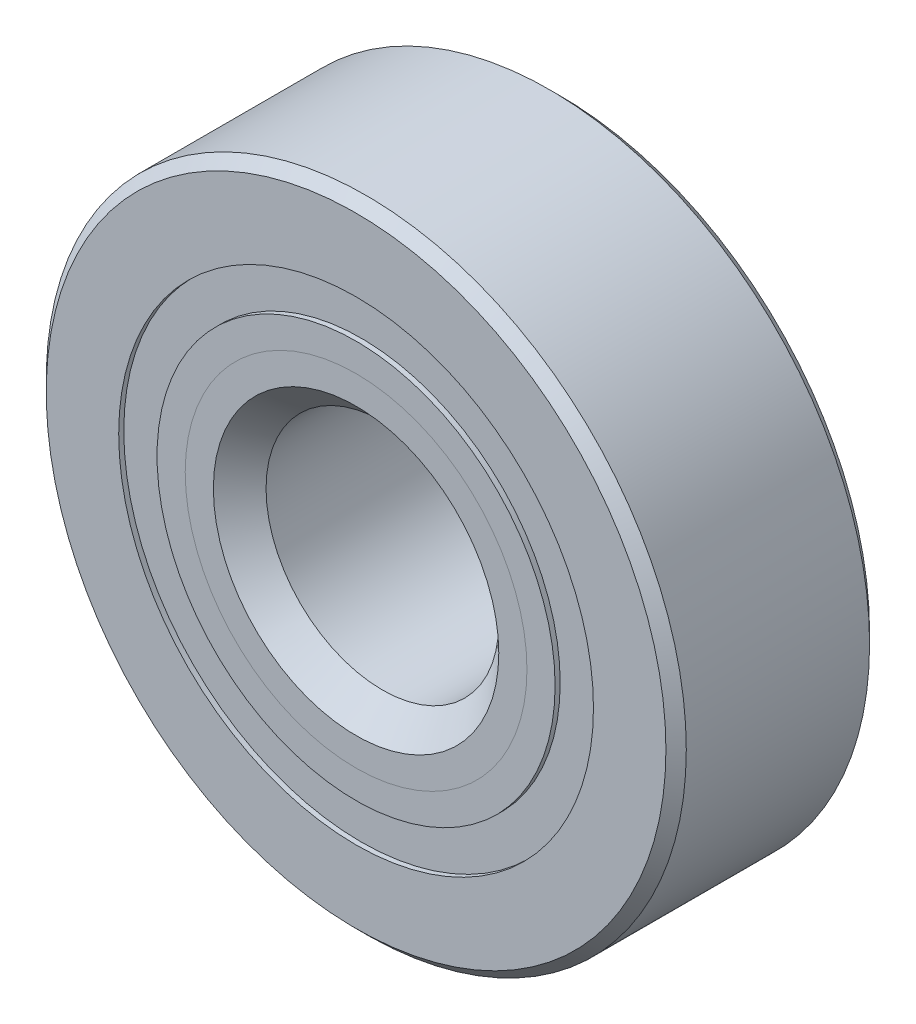
ISO-10303-21;
HEADER;
FILE_DESCRIPTION(('STEP AP214'),'2;1');
FILE_NAME('part.step','',(''),(''),'','','');
FILE_SCHEMA(('AUTOMOTIVE_DESIGN { 1 0 10303 214 1 1 1 1 }'));
ENDSEC;
DATA;
#1=APPLICATION_CONTEXT('core data for automotive mechanical design processes');
#2=APPLICATION_PROTOCOL_DEFINITION('international standard','automotive_design',2000,#1);
#3=PRODUCT_CONTEXT('',#1,'mechanical');
#4=PRODUCT('Part','Part','',(#3));
#5=PRODUCT_RELATED_PRODUCT_CATEGORY('part','',(#4));
#6=PRODUCT_DEFINITION_FORMATION('','',#4);
#7=PRODUCT_DEFINITION_CONTEXT('part definition',#1,'design');
#8=PRODUCT_DEFINITION('design','',#6,#7);
#9=PRODUCT_DEFINITION_SHAPE('','',#8);
#10=(LENGTH_UNIT() NAMED_UNIT(*) SI_UNIT(.MILLI.,.METRE.));
#11=(NAMED_UNIT(*) PLANE_ANGLE_UNIT() SI_UNIT($,.RADIAN.));
#12=(NAMED_UNIT(*) SI_UNIT($,.STERADIAN.) SOLID_ANGLE_UNIT());
#13=UNCERTAINTY_MEASURE_WITH_UNIT(LENGTH_MEASURE(1.E-05),#10,'distance_accuracy_value','');
#14=(GEOMETRIC_REPRESENTATION_CONTEXT(3) GLOBAL_UNCERTAINTY_ASSIGNED_CONTEXT((#13)) GLOBAL_UNIT_ASSIGNED_CONTEXT((#10,
#11,#12)) REPRESENTATION_CONTEXT('',''));
#15=CARTESIAN_POINT('',(0.,0.,0.));
#16=DIRECTION('',(0.,0.,1.));
#17=DIRECTION('',(1.,0.,0.));
#18=AXIS2_PLACEMENT_3D('',#15,#16,#17);
#19=CARTESIAN_POINT('',(0.,12.9529532967033,-5.2784375));
#20=DIRECTION('',(0.,0.,1.));
#21=DIRECTION('',(1.,0.,0.));
#22=AXIS2_PLACEMENT_3D('',#19,#20,#21);
#23=PLANE('',#22);
#24=CARTESIAN_POINT('',(0.,0.,-5.2784375));
#25=DIRECTION('',(0.,0.,1.));
#26=DIRECTION('',(1.,0.,0.));
#27=AXIS2_PLACEMENT_3D('',#24,#25,#26);
#28=CIRCLE('',#27,12.9529532967033);
#29=CARTESIAN_POINT('',(12.9529532967033,0.,-5.2784375));
#30=VERTEX_POINT('',#29);
#31=EDGE_CURVE('E56',#30,#30,#28,.T.);
#32=ORIENTED_EDGE('',*,*,#31,.F.);
#33=EDGE_LOOP('',(#32));
#34=FACE_BOUND('',#33,.T.);
#35=CARTESIAN_POINT('',(0.,0.,-5.2784375));
#36=DIRECTION('',(0.,0.,1.));
#37=DIRECTION('',(1.,0.,0.));
#38=AXIS2_PLACEMENT_3D('',#35,#36,#37);
#39=CIRCLE('',#38,10.8595467032967);
#40=CARTESIAN_POINT('',(10.8595467032967,0.,-5.2784375));
#41=VERTEX_POINT('',#40);
#42=EDGE_CURVE('E11',#41,#41,#39,.T.);
#43=ORIENTED_EDGE('',*,*,#42,.T.);
#44=EDGE_LOOP('',(#43));
#45=FACE_BOUND('',#44,.T.);
#46=ADVANCED_FACE('F42',(#34,#45),#23,.F.);
#47=CARTESIAN_POINT('',(0.,0.,5.55625));
#48=DIRECTION('',(0.,0.,1.));
#49=DIRECTION('',(1.,0.,0.));
#50=AXIS2_PLACEMENT_3D('',#47,#48,#49);
#51=CYLINDRICAL_SURFACE('',#50,10.8595467032967);
#52=ORIENTED_EDGE('',*,*,#42,.F.);
#53=EDGE_LOOP('',(#52));
#54=FACE_BOUND('',#53,.T.);
#55=CARTESIAN_POINT('',(0.,0.,-2.68211551867683));
#56=DIRECTION('',(0.,0.,1.));
#57=DIRECTION('',(1.,0.,0.));
#58=AXIS2_PLACEMENT_3D('',#55,#56,#57);
#59=CIRCLE('',#58,10.8595467032967);
#60=CARTESIAN_POINT('',(10.8595467032967,0.,-2.68211551867683));
#61=VERTEX_POINT('',#60);
#62=EDGE_CURVE('E48',#61,#61,#59,.T.);
#63=ORIENTED_EDGE('',*,*,#62,.T.);
#64=EDGE_LOOP('',(#63));
#65=FACE_BOUND('',#64,.T.);
#66=ADVANCED_FACE('F65',(#54,#65),#51,.F.);
#67=CARTESIAN_POINT('',(0.,12.9529532967033,-2.68211551867683));
#68=DIRECTION('',(0.,0.,-1.));
#69=DIRECTION('',(-1.,0.,0.));
#70=AXIS2_PLACEMENT_3D('',#67,#68,#69);
#71=PLANE('',#70);
#72=ORIENTED_EDGE('',*,*,#62,.F.);
#73=EDGE_LOOP('',(#72));
#74=FACE_BOUND('',#73,.T.);
#75=CARTESIAN_POINT('',(0.,0.,-2.68211551867683));
#76=DIRECTION('',(0.,0.,1.));
#77=DIRECTION('',(1.,0.,0.));
#78=AXIS2_PLACEMENT_3D('',#75,#76,#77);
#79=CIRCLE('',#78,12.9529532967033);
#80=CARTESIAN_POINT('',(12.9529532967033,0.,-2.68211551867683));
#81=VERTEX_POINT('',#80);
#82=EDGE_CURVE('E52',#81,#81,#79,.T.);
#83=ORIENTED_EDGE('',*,*,#82,.T.);
#84=EDGE_LOOP('',(#83));
#85=FACE_BOUND('',#84,.T.);
#86=ADVANCED_FACE('F69',(#74,#85),#71,.F.);
#87=CARTESIAN_POINT('',(0.,0.,5.55625));
#88=DIRECTION('',(0.,0.,1.));
#89=DIRECTION('',(1.,0.,0.));
#90=AXIS2_PLACEMENT_3D('',#87,#88,#89);
#91=CYLINDRICAL_SURFACE('',#90,12.9529532967033);
#92=ORIENTED_EDGE('',*,*,#82,.F.);
#93=EDGE_LOOP('',(#92));
#94=FACE_BOUND('',#93,.T.);
#95=ORIENTED_EDGE('',*,*,#31,.T.);
#96=EDGE_LOOP('',(#95));
#97=FACE_BOUND('',#96,.T.);
#98=ADVANCED_FACE('F62',(#94,#97),#91,.T.);
#99=CLOSED_SHELL('',(#46,#66,#86,#98));
#100=MANIFOLD_SOLID_BREP('B2',#99);
#101=CARTESIAN_POINT('',(0.,12.9529532967033,5.2784375));
#102=DIRECTION('',(0.,0.,-1.));
#103=DIRECTION('',(-1.,0.,0.));
#104=AXIS2_PLACEMENT_3D('',#101,#102,#103);
#105=PLANE('',#104);
#106=CARTESIAN_POINT('',(0.,0.,5.2784375));
#107=DIRECTION('',(0.,0.,1.));
#108=DIRECTION('',(1.,0.,0.));
#109=AXIS2_PLACEMENT_3D('',#106,#107,#108);
#110=CIRCLE('',#109,10.8595467032967);
#111=CARTESIAN_POINT('',(10.8595467032967,0.,5.2784375));
#112=VERTEX_POINT('',#111);
#113=EDGE_CURVE('E41',#112,#112,#110,.T.);
#114=ORIENTED_EDGE('',*,*,#113,.F.);
#115=EDGE_LOOP('',(#114));
#116=FACE_BOUND('',#115,.T.);
#117=CARTESIAN_POINT('',(0.,0.,5.2784375));
#118=DIRECTION('',(0.,0.,1.));
#119=DIRECTION('',(1.,0.,0.));
#120=AXIS2_PLACEMENT_3D('',#117,#118,#119);
#121=CIRCLE('',#120,12.9529532967033);
#122=CARTESIAN_POINT('',(12.9529532967033,0.,5.2784375));
#123=VERTEX_POINT('',#122);
#124=EDGE_CURVE('E124',#123,#123,#121,.T.);
#125=ORIENTED_EDGE('',*,*,#124,.T.);
#126=EDGE_LOOP('',(#125));
#127=FACE_BOUND('',#126,.T.);
#128=ADVANCED_FACE('F110',(#116,#127),#105,.F.);
#129=CARTESIAN_POINT('',(0.,0.,5.55625));
#130=DIRECTION('',(0.,0.,1.));
#131=DIRECTION('',(1.,0.,0.));
#132=AXIS2_PLACEMENT_3D('',#129,#130,#131);
#133=CYLINDRICAL_SURFACE('',#132,10.8595467032967);
#134=CARTESIAN_POINT('',(0.,0.,2.68211551867683));
#135=DIRECTION('',(0.,0.,1.));
#136=DIRECTION('',(1.,0.,0.));
#137=AXIS2_PLACEMENT_3D('',#134,#135,#136);
#138=CIRCLE('',#137,10.8595467032967);
#139=CARTESIAN_POINT('',(10.8595467032967,0.,2.68211551867683));
#140=VERTEX_POINT('',#139);
#141=EDGE_CURVE('E116',#140,#140,#138,.T.);
#142=ORIENTED_EDGE('',*,*,#141,.F.);
#143=EDGE_LOOP('',(#142));
#144=FACE_BOUND('',#143,.T.);
#145=ORIENTED_EDGE('',*,*,#113,.T.);
#146=EDGE_LOOP('',(#145));
#147=FACE_BOUND('',#146,.T.);
#148=ADVANCED_FACE('F139',(#144,#147),#133,.F.);
#149=CARTESIAN_POINT('',(0.,12.9529532967033,2.68211551867683));
#150=DIRECTION('',(0.,0.,1.));
#151=DIRECTION('',(1.,0.,0.));
#152=AXIS2_PLACEMENT_3D('',#149,#150,#151);
#153=PLANE('',#152);
#154=CARTESIAN_POINT('',(0.,0.,2.68211551867683));
#155=DIRECTION('',(0.,0.,1.));
#156=DIRECTION('',(1.,0.,0.));
#157=AXIS2_PLACEMENT_3D('',#154,#155,#156);
#158=CIRCLE('',#157,12.9529532967033);
#159=CARTESIAN_POINT('',(12.9529532967033,0.,2.68211551867683));
#160=VERTEX_POINT('',#159);
#161=EDGE_CURVE('E120',#160,#160,#158,.T.);
#162=ORIENTED_EDGE('',*,*,#161,.F.);
#163=EDGE_LOOP('',(#162));
#164=FACE_BOUND('',#163,.T.);
#165=ORIENTED_EDGE('',*,*,#141,.T.);
#166=EDGE_LOOP('',(#165));
#167=FACE_BOUND('',#166,.T.);
#168=ADVANCED_FACE('F134',(#164,#167),#153,.F.);
#169=CARTESIAN_POINT('',(0.,0.,5.55625));
#170=DIRECTION('',(0.,0.,1.));
#171=DIRECTION('',(1.,0.,0.));
#172=AXIS2_PLACEMENT_3D('',#169,#170,#171);
#173=CYLINDRICAL_SURFACE('',#172,12.9529532967033);
#174=ORIENTED_EDGE('',*,*,#124,.F.);
#175=EDGE_LOOP('',(#174));
#176=FACE_BOUND('',#175,.T.);
#177=ORIENTED_EDGE('',*,*,#161,.T.);
#178=EDGE_LOOP('',(#177));
#179=FACE_BOUND('',#178,.T.);
#180=ADVANCED_FACE('F131',(#176,#179),#173,.T.);
#181=CLOSED_SHELL('',(#128,#148,#168,#180));
#182=MANIFOLD_SOLID_BREP('B6',#181);
#183=CARTESIAN_POINT('',(-5.95312499999987,10.3111149638085,0.));
#184=DIRECTION('',(0.,0.,1.));
#185=DIRECTION('',(-0.499999999999989,0.866025403784445,0.));
#186=AXIS2_PLACEMENT_3D('',#183,#184,#185);
#187=SPHERICAL_SURFACE('',#186,2.68211551867683);
#188=CARTESIAN_POINT('',(-5.95312499999987,10.3111149638085,2.68211551867683));
#189=VERTEX_POINT('',#188);
#190=VERTEX_LOOP('',#189);
#191=FACE_BOUND('',#190,.T.);
#192=ADVANCED_FACE('F179',(#191),#187,.T.);
#193=CLOSED_SHELL('',(#192));
#194=MANIFOLD_SOLID_BREP('B36',#193);
#195=CARTESIAN_POINT('',(-10.3111149638084,5.95312500000012,0.));
#196=DIRECTION('',(0.,0.,1.));
#197=DIRECTION('',(-0.866025403784433,0.50000000000001,0.));
#198=AXIS2_PLACEMENT_3D('',#195,#196,#197);
#199=SPHERICAL_SURFACE('',#198,2.68211551867683);
#200=CARTESIAN_POINT('',(-10.3111149638084,5.95312500000012,2.68211551867683));
#201=VERTEX_POINT('',#200);
#202=VERTEX_LOOP('',#201);
#203=FACE_BOUND('',#202,.T.);
#204=ADVANCED_FACE('F200',(#203),#199,.T.);
#205=CLOSED_SHELL('',(#204));
#206=MANIFOLD_SOLID_BREP('B106',#205);
#207=CARTESIAN_POINT('',(-11.90625,1.24711421304626E-13,0.));
#208=DIRECTION('',(0.,0.,1.));
#209=DIRECTION('',(-1.,0.,0.));
#210=AXIS2_PLACEMENT_3D('',#207,#208,#209);
#211=SPHERICAL_SURFACE('',#210,2.68211551867683);
#212=CARTESIAN_POINT('',(-11.90625,1.24711421304626E-13,2.68211551867683));
#213=VERTEX_POINT('',#212);
#214=VERTEX_LOOP('',#213);
#215=FACE_BOUND('',#214,.T.);
#216=ADVANCED_FACE('F221',(#215),#211,.T.);
#217=CLOSED_SHELL('',(#216));
#218=MANIFOLD_SOLID_BREP('B175',#217);
#219=CARTESIAN_POINT('',(-10.3111149638085,-5.9531249999999,0.));
#220=DIRECTION('',(0.,0.,1.));
#221=DIRECTION('',(-0.866025403784443,-0.499999999999992,0.));
#222=AXIS2_PLACEMENT_3D('',#219,#220,#221);
#223=SPHERICAL_SURFACE('',#222,2.68211551867683);
#224=CARTESIAN_POINT('',(-10.3111149638085,-5.9531249999999,2.68211551867683));
#225=VERTEX_POINT('',#224);
#226=VERTEX_LOOP('',#225);
#227=FACE_BOUND('',#226,.T.);
#228=ADVANCED_FACE('F242',(#227),#223,.T.);
#229=CLOSED_SHELL('',(#228));
#230=MANIFOLD_SOLID_BREP('B196',#229);
#231=CARTESIAN_POINT('',(-5.95312500000009,-10.3111149638084,0.));
#232=DIRECTION('',(0.,0.,1.));
#233=DIRECTION('',(-0.500000000000007,-0.866025403784435,0.));
#234=AXIS2_PLACEMENT_3D('',#231,#232,#233);
#235=SPHERICAL_SURFACE('',#234,2.68211551867683);
#236=CARTESIAN_POINT('',(-5.95312500000009,-10.3111149638084,2.68211551867683));
#237=VERTEX_POINT('',#236);
#238=VERTEX_LOOP('',#237);
#239=FACE_BOUND('',#238,.T.);
#240=ADVANCED_FACE('F263',(#239),#235,.T.);
#241=CLOSED_SHELL('',(#240));
#242=MANIFOLD_SOLID_BREP('B217',#241);
#243=CARTESIAN_POINT('',(0.,-11.90625,0.));
#244=DIRECTION('',(0.,0.,1.));
#245=DIRECTION('',(0.,-1.,0.));
#246=AXIS2_PLACEMENT_3D('',#243,#244,#245);
#247=SPHERICAL_SURFACE('',#246,2.68211551867683);
#248=CARTESIAN_POINT('',(0.,-11.90625,2.68211551867683));
#249=VERTEX_POINT('',#248);
#250=VERTEX_LOOP('',#249);
#251=FACE_BOUND('',#250,.T.);
#252=ADVANCED_FACE('F284',(#251),#247,.T.);
#253=CLOSED_SHELL('',(#252));
#254=MANIFOLD_SOLID_BREP('B238',#253);
#255=CARTESIAN_POINT('',(5.95312499999994,-10.3111149638085,0.));
#256=DIRECTION('',(0.,0.,1.));
#257=DIRECTION('',(0.499999999999995,-0.866025403784442,0.));
#258=AXIS2_PLACEMENT_3D('',#255,#256,#257);
#259=SPHERICAL_SURFACE('',#258,2.68211551867683);
#260=CARTESIAN_POINT('',(5.95312499999994,-10.3111149638085,2.68211551867683));
#261=VERTEX_POINT('',#260);
#262=VERTEX_LOOP('',#261);
#263=FACE_BOUND('',#262,.T.);
#264=ADVANCED_FACE('F305',(#263),#259,.T.);
#265=CLOSED_SHELL('',(#264));
#266=MANIFOLD_SOLID_BREP('B259',#265);
#267=CARTESIAN_POINT('',(10.3111149638084,-5.95312500000005,0.));
#268=DIRECTION('',(0.,0.,1.));
#269=DIRECTION('',(0.866025403784436,-0.500000000000004,0.));
#270=AXIS2_PLACEMENT_3D('',#267,#268,#269);
#271=SPHERICAL_SURFACE('',#270,2.68211551867683);
#272=CARTESIAN_POINT('',(10.3111149638084,-5.95312500000005,2.68211551867683));
#273=VERTEX_POINT('',#272);
#274=VERTEX_LOOP('',#273);
#275=FACE_BOUND('',#274,.T.);
#276=ADVANCED_FACE('F326',(#275),#271,.T.);
#277=CLOSED_SHELL('',(#276));
#278=MANIFOLD_SOLID_BREP('B280',#277);
#279=CARTESIAN_POINT('',(11.90625,0.,0.));
#280=DIRECTION('',(0.,0.,1.));
#281=DIRECTION('',(1.,0.,0.));
#282=AXIS2_PLACEMENT_3D('',#279,#280,#281);
#283=SPHERICAL_SURFACE('',#282,2.68211551867683);
#284=CARTESIAN_POINT('',(11.90625,0.,2.68211551867683));
#285=VERTEX_POINT('',#284);
#286=VERTEX_LOOP('',#285);
#287=FACE_BOUND('',#286,.T.);
#288=ADVANCED_FACE('F347',(#287),#283,.T.);
#289=CLOSED_SHELL('',(#288));
#290=MANIFOLD_SOLID_BREP('B301',#289);
#291=CARTESIAN_POINT('',(10.3111149638085,5.95312499999998,0.));
#292=DIRECTION('',(0.,0.,1.));
#293=DIRECTION('',(0.86602540378444,0.499999999999998,0.));
#294=AXIS2_PLACEMENT_3D('',#291,#292,#293);
#295=SPHERICAL_SURFACE('',#294,2.68211551867683);
#296=CARTESIAN_POINT('',(10.3111149638085,5.95312499999998,2.68211551867683));
#297=VERTEX_POINT('',#296);
#298=VERTEX_LOOP('',#297);
#299=FACE_BOUND('',#298,.T.);
#300=ADVANCED_FACE('F368',(#299),#295,.T.);
#301=CLOSED_SHELL('',(#300));
#302=MANIFOLD_SOLID_BREP('B322',#301);
#303=CARTESIAN_POINT('',(5.95312500000001,10.3111149638085,0.));
#304=DIRECTION('',(0.,0.,1.));
#305=DIRECTION('',(0.500000000000001,0.866025403784438,0.));
#306=AXIS2_PLACEMENT_3D('',#303,#304,#305);
#307=SPHERICAL_SURFACE('',#306,2.68211551867683);
#308=CARTESIAN_POINT('',(5.95312500000001,10.3111149638085,2.68211551867683));
#309=VERTEX_POINT('',#308);
#310=VERTEX_LOOP('',#309);
#311=FACE_BOUND('',#310,.T.);
#312=ADVANCED_FACE('F389',(#311),#307,.T.);
#313=CLOSED_SHELL('',(#312));
#314=MANIFOLD_SOLID_BREP('B343',#313);
#315=CARTESIAN_POINT('',(0.,11.90625,0.));
#316=DIRECTION('',(0.,0.,1.));
#317=DIRECTION('',(0.,1.,0.));
#318=AXIS2_PLACEMENT_3D('',#315,#316,#317);
#319=SPHERICAL_SURFACE('',#318,2.68211551867683);
#320=CARTESIAN_POINT('',(0.,11.90625,2.68211551867683));
#321=VERTEX_POINT('',#320);
#322=VERTEX_LOOP('',#321);
#323=FACE_BOUND('',#322,.T.);
#324=ADVANCED_FACE('F411',(#323),#319,.T.);
#325=CLOSED_SHELL('',(#324));
#326=MANIFOLD_SOLID_BREP('B364',#325);
#327=CARTESIAN_POINT('',(0.,9.32330697197915,5.55625));
#328=DIRECTION('',(0.,0.,-1.));
#329=DIRECTION('',(-1.,0.,0.));
#330=AXIS2_PLACEMENT_3D('',#327,#328,#329);
#331=PLANE('',#330);
#332=CARTESIAN_POINT('',(0.,0.,5.55625));
#333=DIRECTION('',(0.,0.,1.));
#334=DIRECTION('',(1.,0.,0.));
#335=AXIS2_PLACEMENT_3D('',#332,#333,#334);
#336=CIRCLE('',#335,7.78706724066159);
#337=CARTESIAN_POINT('',(7.78706724066159,0.,5.55625));
#338=VERTEX_POINT('',#337);
#339=EDGE_CURVE('E466',#338,#338,#336,.T.);
#340=ORIENTED_EDGE('',*,*,#339,.F.);
#341=EDGE_LOOP('',(#340));
#342=FACE_BOUND('',#341,.T.);
#343=CARTESIAN_POINT('',(0.,0.,5.55625));
#344=DIRECTION('',(0.,0.,1.));
#345=DIRECTION('',(1.,0.,0.));
#346=AXIS2_PLACEMENT_3D('',#343,#344,#345);
#347=CIRCLE('',#346,9.32330697197915);
#348=CARTESIAN_POINT('',(9.32330697197915,0.,5.55625));
#349=VERTEX_POINT('',#348);
#350=EDGE_CURVE('E410',#349,#349,#347,.T.);
#351=ORIENTED_EDGE('',*,*,#350,.T.);
#352=EDGE_LOOP('',(#351));
#353=FACE_BOUND('',#352,.T.);
#354=ADVANCED_FACE('F432',(#342,#353),#331,.F.);
#355=CARTESIAN_POINT('',(0.,0.,4.02001026868245));
#356=DIRECTION('',(0.,0.,1.));
#357=DIRECTION('',(1.,0.,0.));
#358=AXIS2_PLACEMENT_3D('',#355,#356,#357);
#359=CONICAL_SURFACE('',#358,7.78706724066159,0.78539816339745);
#360=ORIENTED_EDGE('',*,*,#350,.F.);
#361=EDGE_LOOP('',(#360));
#362=FACE_BOUND('',#361,.T.);
#363=CARTESIAN_POINT('',(0.,0.,4.02001026868245));
#364=DIRECTION('',(0.,0.,1.));
#365=DIRECTION('',(1.,0.,0.));
#366=AXIS2_PLACEMENT_3D('',#363,#364,#365);
#367=CIRCLE('',#366,7.78706724066159);
#368=CARTESIAN_POINT('',(7.78706724066159,0.,4.02001026868245));
#369=VERTEX_POINT('',#368);
#370=EDGE_CURVE('E438',#369,#369,#367,.T.);
#371=ORIENTED_EDGE('',*,*,#370,.T.);
#372=EDGE_LOOP('',(#371));
#373=FACE_BOUND('',#372,.T.);
#374=ADVANCED_FACE('F473',(#362,#373),#359,.T.);
#375=CARTESIAN_POINT('',(0.,0.,5.55625));
#376=DIRECTION('',(0.,0.,1.));
#377=DIRECTION('',(1.,0.,0.));
#378=AXIS2_PLACEMENT_3D('',#375,#376,#377);
#379=CYLINDRICAL_SURFACE('',#378,7.78706724066159);
#380=ORIENTED_EDGE('',*,*,#370,.F.);
#381=EDGE_LOOP('',(#380));
#382=FACE_BOUND('',#381,.T.);
#383=CARTESIAN_POINT('',(0.,0.,0.));
#384=DIRECTION('',(0.,0.,1.));
#385=DIRECTION('',(1.,0.,0.));
#386=AXIS2_PLACEMENT_3D('',#383,#384,#385);
#387=CIRCLE('',#386,7.78706724066159);
#388=CARTESIAN_POINT('',(7.78706724066159,0.,0.));
#389=VERTEX_POINT('',#388);
#390=EDGE_CURVE('E442',#389,#389,#387,.T.);
#391=ORIENTED_EDGE('',*,*,#390,.T.);
#392=EDGE_LOOP('',(#391));
#393=FACE_BOUND('',#392,.T.);
#394=ADVANCED_FACE('F477',(#382,#393),#379,.T.);
#395=CARTESIAN_POINT('',(0.,7.78706724066159,0.));
#396=DIRECTION('',(0.,0.,-1.));
#397=DIRECTION('',(-1.,0.,0.));
#398=AXIS2_PLACEMENT_3D('',#395,#396,#397);
#399=PLANE('',#398);
#400=ORIENTED_EDGE('',*,*,#390,.F.);
#401=EDGE_LOOP('',(#400));
#402=FACE_BOUND('',#401,.T.);
#403=CARTESIAN_POINT('',(0.,0.,0.));
#404=DIRECTION('',(0.,0.,1.));
#405=DIRECTION('',(1.,0.,0.));
#406=AXIS2_PLACEMENT_3D('',#403,#404,#405);
#407=CIRCLE('',#406,9.22413448132317);
#408=CARTESIAN_POINT('',(9.22413448132317,0.,0.));
#409=VERTEX_POINT('',#408);
#410=EDGE_CURVE('E446',#409,#409,#407,.T.);
#411=ORIENTED_EDGE('',*,*,#410,.T.);
#412=EDGE_LOOP('',(#411));
#413=FACE_BOUND('',#412,.T.);
#414=ADVANCED_FACE('F482',(#402,#413),#399,.F.);
#415=CARTESIAN_POINT('',(0.,0.,0.));
#416=DIRECTION('',(0.,0.,1.));
#417=DIRECTION('',(1.,0.,0.));
#418=AXIS2_PLACEMENT_3D('',#415,#416,#417);
#419=TOROIDAL_SURFACE('',#418,11.90625,2.68211551867683);
#420=ORIENTED_EDGE('',*,*,#410,.F.);
#421=EDGE_LOOP('',(#420));
#422=FACE_BOUND('',#421,.T.);
#423=CARTESIAN_POINT('',(0.,0.,-2.46944444444444));
#424=DIRECTION('',(0.,0.,1.));
#425=DIRECTION('',(1.,0.,0.));
#426=AXIS2_PLACEMENT_3D('',#423,#424,#425);
#427=CIRCLE('',#426,10.8595467032967);
#428=CARTESIAN_POINT('',(10.8595467032967,0.,-2.46944444444444));
#429=VERTEX_POINT('',#428);
#430=EDGE_CURVE('E451',#429,#429,#427,.T.);
#431=ORIENTED_EDGE('',*,*,#430,.T.);
#432=EDGE_LOOP('',(#431));
#433=FACE_BOUND('',#432,.T.);
#434=ADVANCED_FACE('F488',(#422,#433),#419,.F.);
#435=CARTESIAN_POINT('',(0.,0.,5.55625));
#436=DIRECTION('',(0.,0.,1.));
#437=DIRECTION('',(1.,0.,0.));
#438=AXIS2_PLACEMENT_3D('',#435,#436,#437);
#439=CYLINDRICAL_SURFACE('',#438,10.8595467032967);
#440=ORIENTED_EDGE('',*,*,#430,.F.);
#441=EDGE_LOOP('',(#440));
#442=FACE_BOUND('',#441,.T.);
#443=CARTESIAN_POINT('',(0.,0.,-5.55625));
#444=DIRECTION('',(0.,0.,1.));
#445=DIRECTION('',(1.,0.,0.));
#446=AXIS2_PLACEMENT_3D('',#443,#444,#445);
#447=CIRCLE('',#446,10.8595467032967);
#448=CARTESIAN_POINT('',(10.8595467032967,0.,-5.55625));
#449=VERTEX_POINT('',#448);
#450=EDGE_CURVE('E454',#449,#449,#447,.T.);
#451=ORIENTED_EDGE('',*,*,#450,.T.);
#452=EDGE_LOOP('',(#451));
#453=FACE_BOUND('',#452,.T.);
#454=ADVANCED_FACE('F492',(#442,#453),#439,.T.);
#455=CARTESIAN_POINT('',(0.,6.905625,-5.55625));
#456=DIRECTION('',(0.,0.,1.));
#457=DIRECTION('',(1.,0.,0.));
#458=AXIS2_PLACEMENT_3D('',#455,#456,#457);
#459=PLANE('',#458);
#460=ORIENTED_EDGE('',*,*,#450,.F.);
#461=EDGE_LOOP('',(#460));
#462=FACE_BOUND('',#461,.T.);
#463=CARTESIAN_POINT('',(0.,0.,-5.55625));
#464=DIRECTION('',(0.,0.,1.));
#465=DIRECTION('',(1.,0.,0.));
#466=AXIS2_PLACEMENT_3D('',#463,#464,#465);
#467=CIRCLE('',#466,6.905625);
#468=CARTESIAN_POINT('',(6.905625,0.,-5.55625));
#469=VERTEX_POINT('',#468);
#470=EDGE_CURVE('E457',#469,#469,#467,.T.);
#471=ORIENTED_EDGE('',*,*,#470,.T.);
#472=EDGE_LOOP('',(#471));
#473=FACE_BOUND('',#472,.T.);
#474=ADVANCED_FACE('F496',(#462,#473),#459,.F.);
#475=CARTESIAN_POINT('',(0.,0.,-5.000625));
#476=DIRECTION('',(0.,0.,-1.));
#477=DIRECTION('',(-1.,0.,0.));
#478=AXIS2_PLACEMENT_3D('',#475,#476,#477);
#479=CONICAL_SURFACE('',#478,6.35,0.785398163397448);
#480=ORIENTED_EDGE('',*,*,#470,.F.);
#481=EDGE_LOOP('',(#480));
#482=FACE_BOUND('',#481,.T.);
#483=CARTESIAN_POINT('',(0.,0.,-5.000625));
#484=DIRECTION('',(0.,0.,1.));
#485=DIRECTION('',(1.,0.,0.));
#486=AXIS2_PLACEMENT_3D('',#483,#484,#485);
#487=CIRCLE('',#486,6.35);
#488=CARTESIAN_POINT('',(6.35,0.,-5.000625));
#489=VERTEX_POINT('',#488);
#490=EDGE_CURVE('E460',#489,#489,#487,.T.);
#491=ORIENTED_EDGE('',*,*,#490,.T.);
#492=EDGE_LOOP('',(#491));
#493=FACE_BOUND('',#492,.T.);
#494=ADVANCED_FACE('F500',(#482,#493),#479,.F.);
#495=CARTESIAN_POINT('',(0.,0.,5.55625));
#496=DIRECTION('',(0.,0.,1.));
#497=DIRECTION('',(1.,0.,0.));
#498=AXIS2_PLACEMENT_3D('',#495,#496,#497);
#499=CYLINDRICAL_SURFACE('',#498,6.35);
#500=ORIENTED_EDGE('',*,*,#490,.F.);
#501=EDGE_LOOP('',(#500));
#502=FACE_BOUND('',#501,.T.);
#503=CARTESIAN_POINT('',(0.,0.,4.11918275933842));
#504=DIRECTION('',(0.,0.,1.));
#505=DIRECTION('',(1.,0.,0.));
#506=AXIS2_PLACEMENT_3D('',#503,#504,#505);
#507=CIRCLE('',#506,6.35);
#508=CARTESIAN_POINT('',(6.35,0.,4.11918275933842));
#509=VERTEX_POINT('',#508);
#510=EDGE_CURVE('E463',#509,#509,#507,.T.);
#511=ORIENTED_EDGE('',*,*,#510,.T.);
#512=EDGE_LOOP('',(#511));
#513=FACE_BOUND('',#512,.T.);
#514=ADVANCED_FACE('F504',(#502,#513),#499,.F.);
#515=CARTESIAN_POINT('',(0.,0.,5.55625));
#516=DIRECTION('',(0.,0.,1.));
#517=DIRECTION('',(1.,0.,0.));
#518=AXIS2_PLACEMENT_3D('',#515,#516,#517);
#519=CONICAL_SURFACE('',#518,7.78706724066159,0.78539816339745);
#520=ORIENTED_EDGE('',*,*,#510,.F.);
#521=EDGE_LOOP('',(#520));
#522=FACE_BOUND('',#521,.T.);
#523=ORIENTED_EDGE('',*,*,#339,.T.);
#524=EDGE_LOOP('',(#523));
#525=FACE_BOUND('',#524,.T.);
#526=ADVANCED_FACE('F470',(#522,#525),#519,.F.);
#527=CLOSED_SHELL('',(#354,#374,#394,#414,#434,#454,#474,#494,#514,#526));
#528=MANIFOLD_SOLID_BREP('B385',#527);
#529=CARTESIAN_POINT('',(0.,10.8595467032967,5.55625));
#530=DIRECTION('',(0.,0.,-1.));
#531=DIRECTION('',(-1.,0.,0.));
#532=AXIS2_PLACEMENT_3D('',#529,#530,#531);
#533=PLANE('',#532);
#534=CARTESIAN_POINT('',(0.,0.,5.55625));
#535=DIRECTION('',(0.,0.,1.));
#536=DIRECTION('',(1.,0.,0.));
#537=AXIS2_PLACEMENT_3D('',#534,#535,#536);
#538=CIRCLE('',#537,9.32330697197915);
#539=CARTESIAN_POINT('',(9.32330697197915,0.,5.55625));
#540=VERTEX_POINT('',#539);
#541=EDGE_CURVE('E431',#540,#540,#538,.T.);
#542=ORIENTED_EDGE('',*,*,#541,.F.);
#543=EDGE_LOOP('',(#542));
#544=FACE_BOUND('',#543,.T.);
#545=CARTESIAN_POINT('',(0.,0.,5.55625));
#546=DIRECTION('',(0.,0.,1.));
#547=DIRECTION('',(1.,0.,0.));
#548=AXIS2_PLACEMENT_3D('',#545,#546,#547);
#549=CIRCLE('',#548,10.8595467032967);
#550=CARTESIAN_POINT('',(10.8595467032967,0.,5.55625));
#551=VERTEX_POINT('',#550);
#552=EDGE_CURVE('E613',#551,#551,#549,.T.);
#553=ORIENTED_EDGE('',*,*,#552,.T.);
#554=EDGE_LOOP('',(#553));
#555=FACE_BOUND('',#554,.T.);
#556=ADVANCED_FACE('F591',(#544,#555),#533,.F.);
#557=CARTESIAN_POINT('',(0.,0.,5.55625));
#558=DIRECTION('',(0.,0.,1.));
#559=DIRECTION('',(1.,0.,0.));
#560=AXIS2_PLACEMENT_3D('',#557,#558,#559);
#561=CONICAL_SURFACE('',#560,9.32330697197915,0.78539816339745);
#562=CARTESIAN_POINT('',(0.,0.,4.02001026868245));
#563=DIRECTION('',(0.,0.,1.));
#564=DIRECTION('',(1.,0.,0.));
#565=AXIS2_PLACEMENT_3D('',#562,#563,#564);
#566=CIRCLE('',#565,7.78706724066159);
#567=CARTESIAN_POINT('',(7.78706724066159,0.,4.02001026868245));
#568=VERTEX_POINT('',#567);
#569=EDGE_CURVE('E597',#568,#568,#566,.T.);
#570=ORIENTED_EDGE('',*,*,#569,.F.);
#571=EDGE_LOOP('',(#570));
#572=FACE_BOUND('',#571,.T.);
#573=ORIENTED_EDGE('',*,*,#541,.T.);
#574=EDGE_LOOP('',(#573));
#575=FACE_BOUND('',#574,.T.);
#576=ADVANCED_FACE('F638',(#572,#575),#561,.F.);
#577=CARTESIAN_POINT('',(0.,0.,5.55625));
#578=DIRECTION('',(0.,0.,1.));
#579=DIRECTION('',(1.,0.,0.));
#580=AXIS2_PLACEMENT_3D('',#577,#578,#579);
#581=CYLINDRICAL_SURFACE('',#580,7.78706724066159);
#582=CARTESIAN_POINT('',(0.,0.,0.));
#583=DIRECTION('',(0.,0.,1.));
#584=DIRECTION('',(1.,0.,0.));
#585=AXIS2_PLACEMENT_3D('',#582,#583,#584);
#586=CIRCLE('',#585,7.78706724066159);
#587=CARTESIAN_POINT('',(7.78706724066159,0.,0.));
#588=VERTEX_POINT('',#587);
#589=EDGE_CURVE('E601',#588,#588,#586,.T.);
#590=ORIENTED_EDGE('',*,*,#589,.F.);
#591=EDGE_LOOP('',(#590));
#592=FACE_BOUND('',#591,.T.);
#593=ORIENTED_EDGE('',*,*,#569,.T.);
#594=EDGE_LOOP('',(#593));
#595=FACE_BOUND('',#594,.T.);
#596=ADVANCED_FACE('F633',(#592,#595),#581,.F.);
#597=CARTESIAN_POINT('',(0.,7.78706724066159,0.));
#598=DIRECTION('',(0.,0.,1.));
#599=DIRECTION('',(1.,0.,0.));
#600=AXIS2_PLACEMENT_3D('',#597,#598,#599);
#601=PLANE('',#600);
#602=CARTESIAN_POINT('',(0.,0.,0.));
#603=DIRECTION('',(0.,0.,1.));
#604=DIRECTION('',(1.,0.,0.));
#605=AXIS2_PLACEMENT_3D('',#602,#603,#604);
#606=CIRCLE('',#605,9.22413448132317);
#607=CARTESIAN_POINT('',(9.22413448132317,0.,0.));
#608=VERTEX_POINT('',#607);
#609=EDGE_CURVE('E605',#608,#608,#606,.T.);
#610=ORIENTED_EDGE('',*,*,#609,.F.);
#611=EDGE_LOOP('',(#610));
#612=FACE_BOUND('',#611,.T.);
#613=ORIENTED_EDGE('',*,*,#589,.T.);
#614=EDGE_LOOP('',(#613));
#615=FACE_BOUND('',#614,.T.);
#616=ADVANCED_FACE('F627',(#612,#615),#601,.F.);
#617=CARTESIAN_POINT('',(0.,0.,0.));
#618=DIRECTION('',(0.,0.,1.));
#619=DIRECTION('',(1.,0.,0.));
#620=AXIS2_PLACEMENT_3D('',#617,#618,#619);
#621=TOROIDAL_SURFACE('',#620,11.90625,2.68211551867683);
#622=CARTESIAN_POINT('',(0.,0.,2.46944444444444));
#623=DIRECTION('',(0.,0.,1.));
#624=DIRECTION('',(1.,0.,0.));
#625=AXIS2_PLACEMENT_3D('',#622,#623,#624);
#626=CIRCLE('',#625,10.8595467032967);
#627=CARTESIAN_POINT('',(10.8595467032967,0.,2.46944444444444));
#628=VERTEX_POINT('',#627);
#629=EDGE_CURVE('E610',#628,#628,#626,.T.);
#630=ORIENTED_EDGE('',*,*,#629,.F.);
#631=EDGE_LOOP('',(#630));
#632=FACE_BOUND('',#631,.T.);
#633=ORIENTED_EDGE('',*,*,#609,.T.);
#634=EDGE_LOOP('',(#633));
#635=FACE_BOUND('',#634,.T.);
#636=ADVANCED_FACE('F621',(#632,#635),#621,.F.);
#637=CARTESIAN_POINT('',(0.,0.,5.55625));
#638=DIRECTION('',(0.,0.,1.));
#639=DIRECTION('',(1.,0.,0.));
#640=AXIS2_PLACEMENT_3D('',#637,#638,#639);
#641=CYLINDRICAL_SURFACE('',#640,10.8595467032967);
#642=ORIENTED_EDGE('',*,*,#552,.F.);
#643=EDGE_LOOP('',(#642));
#644=FACE_BOUND('',#643,.T.);
#645=ORIENTED_EDGE('',*,*,#629,.T.);
#646=EDGE_LOOP('',(#645));
#647=FACE_BOUND('',#646,.T.);
#648=ADVANCED_FACE('F618',(#644,#647),#641,.T.);
#649=CLOSED_SHELL('',(#556,#576,#596,#616,#636,#648));
#650=MANIFOLD_SOLID_BREP('B405',#649);
#651=CARTESIAN_POINT('',(0.,0.,5.000625));
#652=DIRECTION('',(0.,0.,-1.));
#653=DIRECTION('',(-1.,0.,0.));
#654=AXIS2_PLACEMENT_3D('',#651,#652,#653);
#655=CONICAL_SURFACE('',#654,17.4625,0.785398163397446);
#656=CARTESIAN_POINT('',(0.,0.,5.55625));
#657=DIRECTION('',(0.,0.,1.));
#658=DIRECTION('',(1.,0.,0.));
#659=AXIS2_PLACEMENT_3D('',#656,#657,#658);
#660=CIRCLE('',#659,16.906875);
#661=CARTESIAN_POINT('',(16.906875,0.,5.55625));
#662=VERTEX_POINT('',#661);
#663=EDGE_CURVE('E711',#662,#662,#660,.T.);
#664=ORIENTED_EDGE('',*,*,#663,.F.);
#665=EDGE_LOOP('',(#664));
#666=FACE_BOUND('',#665,.T.);
#667=CARTESIAN_POINT('',(0.,0.,5.000625));
#668=DIRECTION('',(0.,0.,1.));
#669=DIRECTION('',(1.,0.,0.));
#670=AXIS2_PLACEMENT_3D('',#667,#668,#669);
#671=CIRCLE('',#670,17.4625);
#672=CARTESIAN_POINT('',(17.4625,0.,5.000625));
#673=VERTEX_POINT('',#672);
#674=EDGE_CURVE('E590',#673,#673,#671,.T.);
#675=ORIENTED_EDGE('',*,*,#674,.T.);
#676=EDGE_LOOP('',(#675));
#677=FACE_BOUND('',#676,.T.);
#678=ADVANCED_FACE('F683',(#666,#677),#655,.T.);
#679=CARTESIAN_POINT('',(0.,0.,5.55625));
#680=DIRECTION('',(0.,0.,1.));
#681=DIRECTION('',(1.,0.,0.));
#682=AXIS2_PLACEMENT_3D('',#679,#680,#681);
#683=CYLINDRICAL_SURFACE('',#682,17.4625);
#684=ORIENTED_EDGE('',*,*,#674,.F.);
#685=EDGE_LOOP('',(#684));
#686=FACE_BOUND('',#685,.T.);
#687=CARTESIAN_POINT('',(0.,0.,-5.000625));
#688=DIRECTION('',(0.,0.,1.));
#689=DIRECTION('',(1.,0.,0.));
#690=AXIS2_PLACEMENT_3D('',#687,#688,#689);
#691=CIRCLE('',#690,17.4625);
#692=CARTESIAN_POINT('',(17.4625,0.,-5.000625));
#693=VERTEX_POINT('',#692);
#694=EDGE_CURVE('E689',#693,#693,#691,.T.);
#695=ORIENTED_EDGE('',*,*,#694,.T.);
#696=EDGE_LOOP('',(#695));
#697=FACE_BOUND('',#696,.T.);
#698=ADVANCED_FACE('F718',(#686,#697),#683,.T.);
#699=CARTESIAN_POINT('',(0.,0.,-5.55625));
#700=DIRECTION('',(0.,0.,1.));
#701=DIRECTION('',(1.,0.,0.));
#702=AXIS2_PLACEMENT_3D('',#699,#700,#701);
#703=CONICAL_SURFACE('',#702,16.906875,0.785398163397444);
#704=ORIENTED_EDGE('',*,*,#694,.F.);
#705=EDGE_LOOP('',(#704));
#706=FACE_BOUND('',#705,.T.);
#707=CARTESIAN_POINT('',(0.,0.,-5.55625));
#708=DIRECTION('',(0.,0.,1.));
#709=DIRECTION('',(1.,0.,0.));
#710=AXIS2_PLACEMENT_3D('',#707,#708,#709);
#711=CIRCLE('',#710,16.906875);
#712=CARTESIAN_POINT('',(16.906875,0.,-5.55625));
#713=VERTEX_POINT('',#712);
#714=EDGE_CURVE('E693',#713,#713,#711,.T.);
#715=ORIENTED_EDGE('',*,*,#714,.T.);
#716=EDGE_LOOP('',(#715));
#717=FACE_BOUND('',#716,.T.);
#718=ADVANCED_FACE('F722',(#706,#717),#703,.T.);
#719=CARTESIAN_POINT('',(0.,16.906875,-5.55625));
#720=DIRECTION('',(0.,0.,1.));
#721=DIRECTION('',(1.,0.,0.));
#722=AXIS2_PLACEMENT_3D('',#719,#720,#721);
#723=PLANE('',#722);
#724=ORIENTED_EDGE('',*,*,#714,.F.);
#725=EDGE_LOOP('',(#724));
#726=FACE_BOUND('',#725,.T.);
#727=CARTESIAN_POINT('',(0.,0.,-5.55625));
#728=DIRECTION('',(0.,0.,1.));
#729=DIRECTION('',(1.,0.,0.));
#730=AXIS2_PLACEMENT_3D('',#727,#728,#729);
#731=CIRCLE('',#730,12.9529532967033);
#732=CARTESIAN_POINT('',(12.9529532967033,0.,-5.55625));
#733=VERTEX_POINT('',#732);
#734=EDGE_CURVE('E697',#733,#733,#731,.T.);
#735=ORIENTED_EDGE('',*,*,#734,.T.);
#736=EDGE_LOOP('',(#735));
#737=FACE_BOUND('',#736,.T.);
#738=ADVANCED_FACE('F727',(#726,#737),#723,.F.);
#739=CARTESIAN_POINT('',(0.,0.,5.55625));
#740=DIRECTION('',(0.,0.,1.));
#741=DIRECTION('',(1.,0.,0.));
#742=AXIS2_PLACEMENT_3D('',#739,#740,#741);
#743=CYLINDRICAL_SURFACE('',#742,12.9529532967033);
#744=ORIENTED_EDGE('',*,*,#734,.F.);
#745=EDGE_LOOP('',(#744));
#746=FACE_BOUND('',#745,.T.);
#747=CARTESIAN_POINT('',(0.,0.,-2.46944444444444));
#748=DIRECTION('',(0.,0.,1.));
#749=DIRECTION('',(1.,0.,0.));
#750=AXIS2_PLACEMENT_3D('',#747,#748,#749);
#751=CIRCLE('',#750,12.9529532967033);
#752=CARTESIAN_POINT('',(12.9529532967033,0.,-2.46944444444444));
#753=VERTEX_POINT('',#752);
#754=EDGE_CURVE('E702',#753,#753,#751,.T.);
#755=ORIENTED_EDGE('',*,*,#754,.T.);
#756=EDGE_LOOP('',(#755));
#757=FACE_BOUND('',#756,.T.);
#758=ADVANCED_FACE('F733',(#746,#757),#743,.F.);
#759=CARTESIAN_POINT('',(0.,0.,0.));
#760=DIRECTION('',(0.,0.,1.));
#761=DIRECTION('',(1.,0.,0.));
#762=AXIS2_PLACEMENT_3D('',#759,#760,#761);
#763=TOROIDAL_SURFACE('',#762,11.90625,2.68211551867683);
#764=ORIENTED_EDGE('',*,*,#754,.F.);
#765=EDGE_LOOP('',(#764));
#766=FACE_BOUND('',#765,.T.);
#767=CARTESIAN_POINT('',(0.,0.,2.46944444444444));
#768=DIRECTION('',(0.,0.,1.));
#769=DIRECTION('',(1.,0.,0.));
#770=AXIS2_PLACEMENT_3D('',#767,#768,#769);
#771=CIRCLE('',#770,12.9529532967033);
#772=CARTESIAN_POINT('',(12.9529532967033,0.,2.46944444444444));
#773=VERTEX_POINT('',#772);
#774=EDGE_CURVE('E705',#773,#773,#771,.T.);
#775=ORIENTED_EDGE('',*,*,#774,.T.);
#776=EDGE_LOOP('',(#775));
#777=FACE_BOUND('',#776,.T.);
#778=ADVANCED_FACE('F737',(#766,#777),#763,.F.);
#779=CARTESIAN_POINT('',(0.,0.,5.55625));
#780=DIRECTION('',(0.,0.,1.));
#781=DIRECTION('',(1.,0.,0.));
#782=AXIS2_PLACEMENT_3D('',#779,#780,#781);
#783=CYLINDRICAL_SURFACE('',#782,12.9529532967033);
#784=ORIENTED_EDGE('',*,*,#774,.F.);
#785=EDGE_LOOP('',(#784));
#786=FACE_BOUND('',#785,.T.);
#787=CARTESIAN_POINT('',(0.,0.,5.55625));
#788=DIRECTION('',(0.,0.,1.));
#789=DIRECTION('',(1.,0.,0.));
#790=AXIS2_PLACEMENT_3D('',#787,#788,#789);
#791=CIRCLE('',#790,12.9529532967033);
#792=CARTESIAN_POINT('',(12.9529532967033,0.,5.55625));
#793=VERTEX_POINT('',#792);
#794=EDGE_CURVE('E708',#793,#793,#791,.T.);
#795=ORIENTED_EDGE('',*,*,#794,.T.);
#796=EDGE_LOOP('',(#795));
#797=FACE_BOUND('',#796,.T.);
#798=ADVANCED_FACE('F741',(#786,#797),#783,.F.);
#799=CARTESIAN_POINT('',(0.,16.906875,5.55625));
#800=DIRECTION('',(0.,0.,-1.));
#801=DIRECTION('',(-1.,0.,0.));
#802=AXIS2_PLACEMENT_3D('',#799,#800,#801);
#803=PLANE('',#802);
#804=ORIENTED_EDGE('',*,*,#794,.F.);
#805=EDGE_LOOP('',(#804));
#806=FACE_BOUND('',#805,.T.);
#807=ORIENTED_EDGE('',*,*,#663,.T.);
#808=EDGE_LOOP('',(#807));
#809=FACE_BOUND('',#808,.T.);
#810=ADVANCED_FACE('F715',(#806,#809),#803,.F.);
#811=CLOSED_SHELL('',(#678,#698,#718,#738,#758,#778,#798,#810));
#812=MANIFOLD_SOLID_BREP('B426',#811);
#813=ADVANCED_BREP_SHAPE_REPRESENTATION('',(#18,#100,#182,#194,#206,#218,#230,#242,#254,#266,
#278,#290,#302,#314,#326,#528,#650,#812),#14);
#814=SHAPE_DEFINITION_REPRESENTATION(#9,#813);
ENDSEC;
END-ISO-10303-21;
